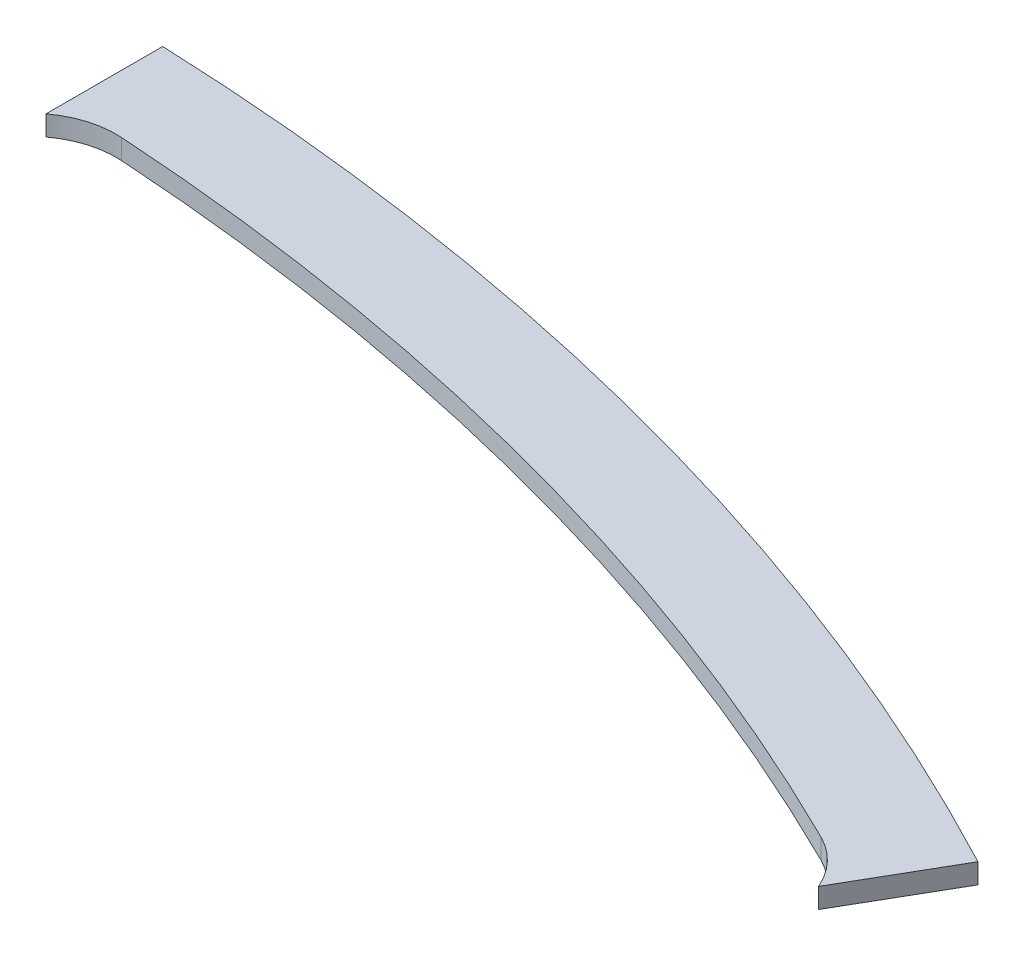
ISO-10303-21;
HEADER;
FILE_DESCRIPTION(('STEP AP214'),'2;1');
FILE_NAME('part.step','',(''),(''),'','','');
FILE_SCHEMA(('AUTOMOTIVE_DESIGN { 1 0 10303 214 1 1 1 1 }'));
ENDSEC;
DATA;
#1=APPLICATION_CONTEXT('core data for automotive mechanical design processes');
#2=APPLICATION_PROTOCOL_DEFINITION('international standard','automotive_design',2000,#1);
#3=PRODUCT_CONTEXT('',#1,'mechanical');
#4=PRODUCT('Part','Part','',(#3));
#5=PRODUCT_RELATED_PRODUCT_CATEGORY('part','',(#4));
#6=PRODUCT_DEFINITION_FORMATION('','',#4);
#7=PRODUCT_DEFINITION_CONTEXT('part definition',#1,'design');
#8=PRODUCT_DEFINITION('design','',#6,#7);
#9=PRODUCT_DEFINITION_SHAPE('','',#8);
#10=(LENGTH_UNIT() NAMED_UNIT(*) SI_UNIT(.MILLI.,.METRE.));
#11=(NAMED_UNIT(*) PLANE_ANGLE_UNIT() SI_UNIT($,.RADIAN.));
#12=(NAMED_UNIT(*) SI_UNIT($,.STERADIAN.) SOLID_ANGLE_UNIT());
#13=UNCERTAINTY_MEASURE_WITH_UNIT(LENGTH_MEASURE(1.E-05),#10,'distance_accuracy_value','');
#14=(GEOMETRIC_REPRESENTATION_CONTEXT(3) GLOBAL_UNCERTAINTY_ASSIGNED_CONTEXT((#13)) GLOBAL_UNIT_ASSIGNED_CONTEXT((#10,
#11,#12)) REPRESENTATION_CONTEXT('',''));
#15=CARTESIAN_POINT('',(0.,0.,0.));
#16=DIRECTION('',(0.,0.,1.));
#17=DIRECTION('',(1.,0.,0.));
#18=AXIS2_PLACEMENT_3D('',#15,#16,#17);
#19=CARTESIAN_POINT('',(0.,2.29,0.));
#20=DIRECTION('',(0.,-1.,0.));
#21=DIRECTION('',(0.,0.,-1.));
#22=AXIS2_PLACEMENT_3D('',#19,#20,#21);
#23=CYLINDRICAL_SURFACE('',#22,297.5);
#24=CARTESIAN_POINT('',(0.,2.29,0.));
#25=DIRECTION('',(0.,1.,0.));
#26=DIRECTION('',(0.,0.,-1.));
#27=AXIS2_PLACEMENT_3D('',#24,#25,#26);
#28=CIRCLE('',#27,297.5);
#29=CARTESIAN_POINT('',(138.679531856133,2.29,-263.199995144688));
#30=VERTEX_POINT('',#29);
#31=CARTESIAN_POINT('',(11.5,2.29,-297.277647999307));
#32=VERTEX_POINT('',#31);
#33=EDGE_CURVE('E135',#30,#32,#28,.T.);
#34=ORIENTED_EDGE('',*,*,#33,.F.);
#35=DIRECTION('',(0.,-1.,0.));
#36=VECTOR('',#35,1.);
#37=CARTESIAN_POINT('',(138.679531856133,2.29,-263.199995144688));
#38=LINE('',#37,#36);
#39=CARTESIAN_POINT('',(138.679531856133,0.,-263.199995144688));
#40=VERTEX_POINT('',#39);
#41=EDGE_CURVE('E154',#30,#40,#38,.T.);
#42=ORIENTED_EDGE('',*,*,#41,.T.);
#43=CARTESIAN_POINT('',(0.,0.,0.));
#44=DIRECTION('',(0.,1.,0.));
#45=DIRECTION('',(0.,0.,-1.));
#46=AXIS2_PLACEMENT_3D('',#43,#44,#45);
#47=CIRCLE('',#46,297.5);
#48=CARTESIAN_POINT('',(11.5,0.,-297.277647999307));
#49=VERTEX_POINT('',#48);
#50=EDGE_CURVE('E107',#40,#49,#47,.T.);
#51=ORIENTED_EDGE('',*,*,#50,.T.);
#52=DIRECTION('',(0.,-1.,0.));
#53=VECTOR('',#52,1.);
#54=CARTESIAN_POINT('',(11.5,2.29,-297.277647999307));
#55=LINE('',#54,#53);
#56=EDGE_CURVE('E144',#49,#32,#55,.F.);
#57=ORIENTED_EDGE('',*,*,#56,.T.);
#58=EDGE_LOOP('',(#34,#42,#51,#57));
#59=FACE_BOUND('',#58,.T.);
#60=ADVANCED_FACE('F43',(#59),#23,.T.);
#61=CARTESIAN_POINT('',(0.,2.29,0.));
#62=DIRECTION('',(0.,-1.,0.));
#63=DIRECTION('',(0.,0.,-1.));
#64=AXIS2_PLACEMENT_3D('',#61,#62,#63);
#65=PLANE('',#64);
#66=CARTESIAN_POINT('',(122.817560276445,2.29,-247.726254460454));
#67=DIRECTION('',(0.,-1.,0.));
#68=DIRECTION('',(0.,0.,-1.));
#69=AXIS2_PLACEMENT_3D('',#66,#67,#68);
#70=CIRCLE('',#69,10.);
#71=CARTESIAN_POINT('',(127.259419206672,2.29,-256.685600934609));
#72=VERTEX_POINT('',#71);
#73=CARTESIAN_POINT('',(132.013712699151,2.29,-251.65445769073));
#74=VERTEX_POINT('',#73);
#75=EDGE_CURVE('E114',#72,#74,#70,.T.);
#76=ORIENTED_EDGE('',*,*,#75,.T.);
#77=DIRECTION('',(0.500000000000001,0.,-0.866025403784438));
#78=VECTOR('',#77,1.);
#79=CARTESIAN_POINT('',(-9.9592921435209,2.29,-5.74999999999993));
#80=LINE('',#79,#78);
#81=EDGE_CURVE('E59',#74,#30,#80,.T.);
#82=ORIENTED_EDGE('',*,*,#81,.T.);
#83=ORIENTED_EDGE('',*,*,#33,.T.);
#84=DIRECTION('',(0.,0.,1.));
#85=VECTOR('',#84,1.);
#86=CARTESIAN_POINT('',(11.5,2.29,0.));
#87=LINE('',#86,#85);
#88=CARTESIAN_POINT('',(11.5,2.29,-283.946009685344));
#89=VERTEX_POINT('',#88);
#90=EDGE_CURVE('E148',#32,#89,#87,.T.);
#91=ORIENTED_EDGE('',*,*,#90,.T.);
#92=CARTESIAN_POINT('',(17.5,2.29,-275.946009685344));
#93=DIRECTION('',(0.,-1.,0.));
#94=DIRECTION('',(0.,0.,-1.));
#95=AXIS2_PLACEMENT_3D('',#92,#93,#94);
#96=CIRCLE('',#95,10.);
#97=CARTESIAN_POINT('',(18.1329105634734,2.29,-285.925960798383));
#98=VERTEX_POINT('',#97);
#99=EDGE_CURVE('E124',#89,#98,#96,.T.);
#100=ORIENTED_EDGE('',*,*,#99,.T.);
#101=CARTESIAN_POINT('',(0.,2.29,0.));
#102=DIRECTION('',(0.,1.,0.));
#103=DIRECTION('',(0.,0.,1.));
#104=AXIS2_PLACEMENT_3D('',#101,#102,#103);
#105=CIRCLE('',#104,286.500362135864);
#106=EDGE_CURVE('E138',#72,#98,#105,.T.);
#107=ORIENTED_EDGE('',*,*,#106,.F.);
#108=EDGE_LOOP('',(#76,#82,#83,#91,#100,#107));
#109=FACE_BOUND('',#108,.T.);
#110=ADVANCED_FACE('F160',(#109),#65,.F.);
#111=CARTESIAN_POINT('',(0.,0.,0.));
#112=DIRECTION('',(0.,-1.,0.));
#113=DIRECTION('',(0.,0.,-1.));
#114=AXIS2_PLACEMENT_3D('',#111,#112,#113);
#115=PLANE('',#114);
#116=DIRECTION('',(0.500000000000001,0.,-0.866025403784438));
#117=VECTOR('',#116,1.);
#118=CARTESIAN_POINT('',(-9.9592921435209,0.,-5.74999999999993));
#119=LINE('',#118,#117);
#120=CARTESIAN_POINT('',(132.013712699151,0.,-251.65445769073));
#121=VERTEX_POINT('',#120);
#122=EDGE_CURVE('E96',#121,#40,#119,.T.);
#123=ORIENTED_EDGE('',*,*,#122,.F.);
#124=CARTESIAN_POINT('',(122.817560276445,0.,-247.726254460454));
#125=DIRECTION('',(0.,-1.,0.));
#126=DIRECTION('',(0.,0.,-1.));
#127=AXIS2_PLACEMENT_3D('',#124,#125,#126);
#128=CIRCLE('',#127,10.);
#129=CARTESIAN_POINT('',(127.259419206672,0.,-256.685600934609));
#130=VERTEX_POINT('',#129);
#131=EDGE_CURVE('E105',#121,#130,#128,.F.);
#132=ORIENTED_EDGE('',*,*,#131,.T.);
#133=CARTESIAN_POINT('',(0.,0.,0.));
#134=DIRECTION('',(0.,-1.,0.));
#135=DIRECTION('',(0.,0.,-1.));
#136=AXIS2_PLACEMENT_3D('',#133,#134,#135);
#137=CIRCLE('',#136,286.500362135864);
#138=CARTESIAN_POINT('',(18.1329105634734,0.,-285.925960798383));
#139=VERTEX_POINT('',#138);
#140=EDGE_CURVE('E132',#139,#130,#137,.T.);
#141=ORIENTED_EDGE('',*,*,#140,.F.);
#142=CARTESIAN_POINT('',(17.5,0.,-275.946009685344));
#143=DIRECTION('',(0.,-1.,0.));
#144=DIRECTION('',(0.,0.,-1.));
#145=AXIS2_PLACEMENT_3D('',#142,#143,#144);
#146=CIRCLE('',#145,10.);
#147=CARTESIAN_POINT('',(11.5,0.,-283.946009685344));
#148=VERTEX_POINT('',#147);
#149=EDGE_CURVE('E118',#139,#148,#146,.F.);
#150=ORIENTED_EDGE('',*,*,#149,.T.);
#151=DIRECTION('',(0.,0.,1.));
#152=VECTOR('',#151,1.);
#153=CARTESIAN_POINT('',(11.5,0.,0.));
#154=LINE('',#153,#152);
#155=EDGE_CURVE('E66',#49,#148,#154,.T.);
#156=ORIENTED_EDGE('',*,*,#155,.F.);
#157=ORIENTED_EDGE('',*,*,#50,.F.);
#158=EDGE_LOOP('',(#123,#132,#141,#150,#156,#157));
#159=FACE_BOUND('',#158,.T.);
#160=ADVANCED_FACE('F103',(#159),#115,.T.);
#161=CARTESIAN_POINT('',(0.,-0.71,0.));
#162=DIRECTION('',(0.,1.,0.));
#163=DIRECTION('',(0.,0.,1.));
#164=AXIS2_PLACEMENT_3D('',#161,#162,#163);
#165=CYLINDRICAL_SURFACE('',#164,286.500362135864);
#166=ORIENTED_EDGE('',*,*,#106,.T.);
#167=DIRECTION('',(0.,1.,0.));
#168=VECTOR('',#167,1.);
#169=CARTESIAN_POINT('',(18.1329105634734,-0.71,-285.925960798383));
#170=LINE('',#169,#168);
#171=EDGE_CURVE('E127',#98,#139,#170,.F.);
#172=ORIENTED_EDGE('',*,*,#171,.T.);
#173=ORIENTED_EDGE('',*,*,#140,.T.);
#174=DIRECTION('',(0.,1.,0.));
#175=VECTOR('',#174,1.);
#176=CARTESIAN_POINT('',(127.259419206672,-0.71,-256.685600934609));
#177=LINE('',#176,#175);
#178=EDGE_CURVE('E112',#130,#72,#177,.T.);
#179=ORIENTED_EDGE('',*,*,#178,.T.);
#180=EDGE_LOOP('',(#166,#172,#173,#179));
#181=FACE_BOUND('',#180,.T.);
#182=ADVANCED_FACE('F171',(#181),#165,.F.);
#183=CARTESIAN_POINT('',(17.5,-0.71,-275.946009685344));
#184=DIRECTION('',(0.,1.,0.));
#185=DIRECTION('',(0.,0.,1.));
#186=AXIS2_PLACEMENT_3D('',#183,#184,#185);
#187=CYLINDRICAL_SURFACE('',#186,10.);
#188=ORIENTED_EDGE('',*,*,#99,.F.);
#189=DIRECTION('',(0.,1.,0.));
#190=VECTOR('',#189,1.);
#191=CARTESIAN_POINT('',(11.5,-0.71,-283.946009685344));
#192=LINE('',#191,#190);
#193=EDGE_CURVE('E52',#89,#148,#192,.F.);
#194=ORIENTED_EDGE('',*,*,#193,.T.);
#195=ORIENTED_EDGE('',*,*,#149,.F.);
#196=ORIENTED_EDGE('',*,*,#171,.F.);
#197=EDGE_LOOP('',(#188,#194,#195,#196));
#198=FACE_BOUND('',#197,.T.);
#199=ADVANCED_FACE('F169',(#198),#187,.F.);
#200=CARTESIAN_POINT('',(122.817560276445,-0.71,-247.726254460454));
#201=DIRECTION('',(0.,1.,0.));
#202=DIRECTION('',(0.,0.,1.));
#203=AXIS2_PLACEMENT_3D('',#200,#201,#202);
#204=CYLINDRICAL_SURFACE('',#203,10.);
#205=ORIENTED_EDGE('',*,*,#131,.F.);
#206=DIRECTION('',(0.,1.,0.));
#207=VECTOR('',#206,1.);
#208=CARTESIAN_POINT('',(132.013712699151,-0.71,-251.65445769073));
#209=LINE('',#208,#207);
#210=EDGE_CURVE('E11',#121,#74,#209,.T.);
#211=ORIENTED_EDGE('',*,*,#210,.T.);
#212=ORIENTED_EDGE('',*,*,#75,.F.);
#213=ORIENTED_EDGE('',*,*,#178,.F.);
#214=EDGE_LOOP('',(#205,#211,#212,#213));
#215=FACE_BOUND('',#214,.T.);
#216=ADVANCED_FACE('F45',(#215),#204,.F.);
#217=CARTESIAN_POINT('',(11.5,0.,0.));
#218=DIRECTION('',(1.,0.,0.));
#219=DIRECTION('',(0.,0.,-1.));
#220=AXIS2_PLACEMENT_3D('',#217,#218,#219);
#221=PLANE('',#220);
#222=ORIENTED_EDGE('',*,*,#155,.T.);
#223=ORIENTED_EDGE('',*,*,#193,.F.);
#224=ORIENTED_EDGE('',*,*,#90,.F.);
#225=ORIENTED_EDGE('',*,*,#56,.F.);
#226=EDGE_LOOP('',(#222,#223,#224,#225));
#227=FACE_BOUND('',#226,.T.);
#228=ADVANCED_FACE('F164',(#227),#221,.F.);
#229=CARTESIAN_POINT('',(-9.95929214352089,0.,-5.74999999999993));
#230=DIRECTION('',(-0.866025403784438,0.,-0.500000000000001));
#231=DIRECTION('',(-0.500000000000001,0.,0.866025403784438));
#232=AXIS2_PLACEMENT_3D('',#229,#230,#231);
#233=PLANE('',#232);
#234=ORIENTED_EDGE('',*,*,#81,.F.);
#235=ORIENTED_EDGE('',*,*,#210,.F.);
#236=ORIENTED_EDGE('',*,*,#122,.T.);
#237=ORIENTED_EDGE('',*,*,#41,.F.);
#238=EDGE_LOOP('',(#234,#235,#236,#237));
#239=FACE_BOUND('',#238,.T.);
#240=ADVANCED_FACE('F95',(#239),#233,.F.);
#241=CLOSED_SHELL('',(#60,#110,#160,#182,#199,#216,#228,#240));
#242=MANIFOLD_SOLID_BREP('B2',#241);
#243=ADVANCED_BREP_SHAPE_REPRESENTATION('',(#18,#242),#14);
#244=SHAPE_DEFINITION_REPRESENTATION(#9,#243);
ENDSEC;
END-ISO-10303-21;
